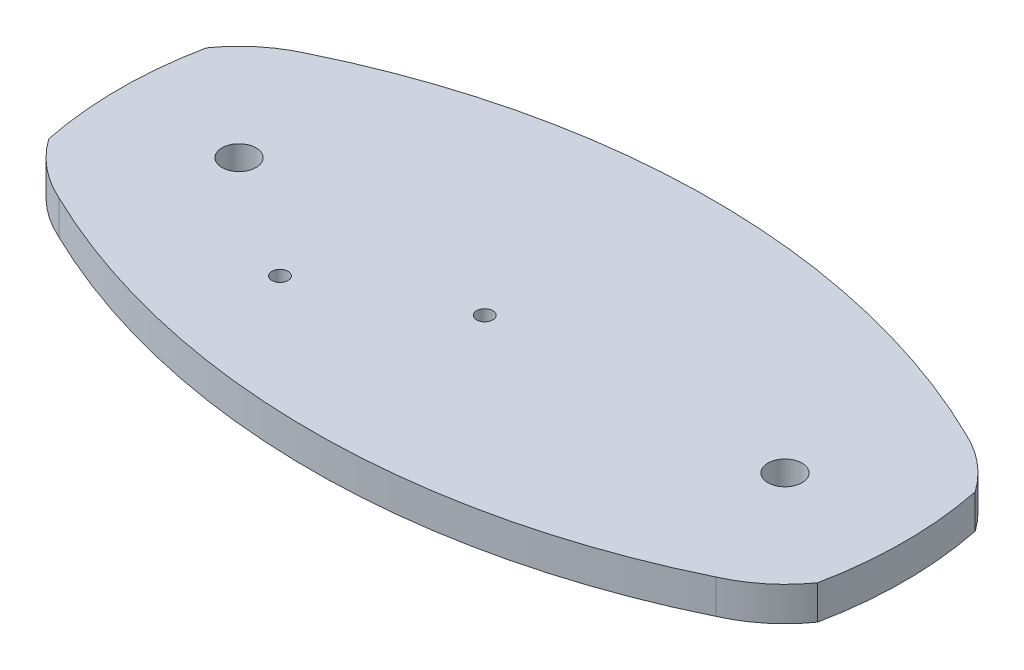
ISO-10303-21;
HEADER;
FILE_DESCRIPTION(('STEP AP214'),'2;1');
FILE_NAME('part.step','',(''),(''),'','','');
FILE_SCHEMA(('AUTOMOTIVE_DESIGN { 1 0 10303 214 1 1 1 1 }'));
ENDSEC;
DATA;
#1=APPLICATION_CONTEXT('core data for automotive mechanical design processes');
#2=APPLICATION_PROTOCOL_DEFINITION('international standard','automotive_design',2000,#1);
#3=PRODUCT_CONTEXT('',#1,'mechanical');
#4=PRODUCT('Part','Part','',(#3));
#5=PRODUCT_RELATED_PRODUCT_CATEGORY('part','',(#4));
#6=PRODUCT_DEFINITION_FORMATION('','',#4);
#7=PRODUCT_DEFINITION_CONTEXT('part definition',#1,'design');
#8=PRODUCT_DEFINITION('design','',#6,#7);
#9=PRODUCT_DEFINITION_SHAPE('','',#8);
#10=(LENGTH_UNIT() NAMED_UNIT(*) SI_UNIT(.MILLI.,.METRE.));
#11=(NAMED_UNIT(*) PLANE_ANGLE_UNIT() SI_UNIT($,.RADIAN.));
#12=(NAMED_UNIT(*) SI_UNIT($,.STERADIAN.) SOLID_ANGLE_UNIT());
#13=UNCERTAINTY_MEASURE_WITH_UNIT(LENGTH_MEASURE(1.E-05),#10,'distance_accuracy_value','');
#14=(GEOMETRIC_REPRESENTATION_CONTEXT(3) GLOBAL_UNCERTAINTY_ASSIGNED_CONTEXT((#13)) GLOBAL_UNIT_ASSIGNED_CONTEXT((#10,
#11,#12)) REPRESENTATION_CONTEXT('',''));
#15=CARTESIAN_POINT('',(0.,0.,0.));
#16=DIRECTION('',(0.,0.,1.));
#17=DIRECTION('',(1.,0.,0.));
#18=AXIS2_PLACEMENT_3D('',#15,#16,#17);
#19=CARTESIAN_POINT('',(0.,6.35,0.));
#20=DIRECTION('',(0.,-1.,0.));
#21=DIRECTION('',(0.,0.,-1.));
#22=AXIS2_PLACEMENT_3D('',#19,#20,#21);
#23=CYLINDRICAL_SURFACE('',#22,73.025);
#24=DIRECTION('',(0.,1.,0.));
#25=VECTOR('',#24,1.);
#26=CARTESIAN_POINT('',(-71.53671875,0.,-14.6679410785359));
#27=LINE('',#26,#25);
#28=CARTESIAN_POINT('',(-71.53671875,0.,-14.6679410785359));
#29=VERTEX_POINT('',#28);
#30=CARTESIAN_POINT('',(-71.53671875,6.35,-14.6679410785359));
#31=VERTEX_POINT('',#30);
#32=EDGE_CURVE('E146',#29,#31,#27,.T.);
#33=ORIENTED_EDGE('',*,*,#32,.F.);
#34=CARTESIAN_POINT('',(0.,0.,0.));
#35=DIRECTION('',(0.,1.,0.));
#36=DIRECTION('',(0.,0.,1.));
#37=AXIS2_PLACEMENT_3D('',#34,#35,#36);
#38=CIRCLE('',#37,73.025);
#39=CARTESIAN_POINT('',(-71.53671875,0.,14.6679410785359));
#40=VERTEX_POINT('',#39);
#41=EDGE_CURVE('E127',#29,#40,#38,.T.);
#42=ORIENTED_EDGE('',*,*,#41,.T.);
#43=DIRECTION('',(0.,1.,0.));
#44=VECTOR('',#43,1.);
#45=CARTESIAN_POINT('',(-71.53671875,0.,14.6679410785359));
#46=LINE('',#45,#44);
#47=CARTESIAN_POINT('',(-71.53671875,6.35,14.6679410785359));
#48=VERTEX_POINT('',#47);
#49=EDGE_CURVE('E64',#40,#48,#46,.T.);
#50=ORIENTED_EDGE('',*,*,#49,.T.);
#51=CARTESIAN_POINT('',(0.,6.35,0.));
#52=DIRECTION('',(0.,1.,0.));
#53=DIRECTION('',(0.,0.,1.));
#54=AXIS2_PLACEMENT_3D('',#51,#52,#53);
#55=CIRCLE('',#54,73.025);
#56=EDGE_CURVE('E49',#31,#48,#55,.T.);
#57=ORIENTED_EDGE('',*,*,#56,.F.);
#58=EDGE_LOOP('',(#33,#42,#50,#57));
#59=FACE_BOUND('',#58,.T.);
#60=ADVANCED_FACE('F40',(#59),#23,.T.);
#61=DIRECTION('',(0.,1.,0.));
#62=VECTOR('',#61,1.);
#63=CARTESIAN_POINT('',(71.53671875,0.,-14.6679410785359));
#64=LINE('',#63,#62);
#65=CARTESIAN_POINT('',(71.53671875,0.,-14.6679410785359));
#66=VERTEX_POINT('',#65);
#67=CARTESIAN_POINT('',(71.53671875,6.35,-14.6679410785359));
#68=VERTEX_POINT('',#67);
#69=EDGE_CURVE('E149',#66,#68,#64,.T.);
#70=ORIENTED_EDGE('',*,*,#69,.T.);
#71=CARTESIAN_POINT('',(71.53671875,6.35,14.6679410785359));
#72=VERTEX_POINT('',#71);
#73=EDGE_CURVE('E11',#72,#68,#55,.T.);
#74=ORIENTED_EDGE('',*,*,#73,.F.);
#75=DIRECTION('',(0.,1.,0.));
#76=VECTOR('',#75,1.);
#77=CARTESIAN_POINT('',(71.53671875,0.,14.6679410785359));
#78=LINE('',#77,#76);
#79=CARTESIAN_POINT('',(71.53671875,0.,14.6679410785359));
#80=VERTEX_POINT('',#79);
#81=EDGE_CURVE('E190',#80,#72,#78,.T.);
#82=ORIENTED_EDGE('',*,*,#81,.F.);
#83=EDGE_CURVE('E43',#80,#66,#38,.T.);
#84=ORIENTED_EDGE('',*,*,#83,.T.);
#85=EDGE_LOOP('',(#70,#74,#82,#84));
#86=FACE_BOUND('',#85,.T.);
#87=ADVANCED_FACE('F209',(#86),#23,.T.);
#88=CARTESIAN_POINT('',(0.,6.35,0.));
#89=DIRECTION('',(0.,1.,0.));
#90=DIRECTION('',(0.,0.,1.));
#91=AXIS2_PLACEMENT_3D('',#88,#89,#90);
#92=PLANE('',#91);
#93=CARTESIAN_POINT('',(-27.94,6.35,15.24));
#94=DIRECTION('',(0.,1.,0.));
#95=DIRECTION('',(0.,0.,1.));
#96=AXIS2_PLACEMENT_3D('',#93,#94,#95);
#97=CIRCLE('',#96,1.49999999999999);
#98=CARTESIAN_POINT('',(-27.94,6.35,16.74));
#99=VERTEX_POINT('',#98);
#100=EDGE_CURVE('E353',#99,#99,#97,.T.);
#101=ORIENTED_EDGE('',*,*,#100,.F.);
#102=EDGE_LOOP('',(#101));
#103=FACE_BOUND('',#102,.T.);
#104=CARTESIAN_POINT('',(-2.54,6.35,2.54));
#105=DIRECTION('',(0.,1.,0.));
#106=DIRECTION('',(0.,0.,1.));
#107=AXIS2_PLACEMENT_3D('',#104,#105,#106);
#108=CIRCLE('',#107,1.49999999999999);
#109=CARTESIAN_POINT('',(-2.54,6.35,4.03999999999999));
#110=VERTEX_POINT('',#109);
#111=EDGE_CURVE('E357',#110,#110,#108,.T.);
#112=ORIENTED_EDGE('',*,*,#111,.F.);
#113=EDGE_LOOP('',(#112));
#114=FACE_BOUND('',#113,.T.);
#115=CARTESIAN_POINT('',(-50.8,6.35,0.));
#116=DIRECTION('',(0.,1.,0.));
#117=DIRECTION('',(0.,0.,1.));
#118=AXIS2_PLACEMENT_3D('',#115,#116,#117);
#119=CIRCLE('',#118,3.175);
#120=CARTESIAN_POINT('',(-50.8,6.35,3.175));
#121=VERTEX_POINT('',#120);
#122=EDGE_CURVE('E159',#121,#121,#119,.T.);
#123=ORIENTED_EDGE('',*,*,#122,.F.);
#124=EDGE_LOOP('',(#123));
#125=FACE_BOUND('',#124,.T.);
#126=CARTESIAN_POINT('',(50.8,6.35,0.));
#127=DIRECTION('',(0.,1.,0.));
#128=DIRECTION('',(0.,0.,1.));
#129=AXIS2_PLACEMENT_3D('',#126,#127,#128);
#130=CIRCLE('',#129,3.175);
#131=CARTESIAN_POINT('',(50.8,6.35,3.175));
#132=VERTEX_POINT('',#131);
#133=EDGE_CURVE('E160',#132,#132,#130,.F.);
#134=ORIENTED_EDGE('',*,*,#133,.T.);
#135=EDGE_LOOP('',(#134));
#136=FACE_BOUND('',#135,.T.);
#137=CARTESIAN_POINT('',(0.,6.35,102.409936312052));
#138=DIRECTION('',(0.,1.,0.));
#139=DIRECTION('',(0.,0.,1.));
#140=AXIS2_PLACEMENT_3D('',#137,#138,#139);
#141=CIRCLE('',#140,139.7);
#142=CARTESIAN_POINT('',(-61.1507706135103,6.35,-23.1952914986316));
#143=VERTEX_POINT('',#142);
#144=CARTESIAN_POINT('',(61.1507706135103,6.35,-23.1952914986316));
#145=VERTEX_POINT('',#144);
#146=EDGE_CURVE('E133',#143,#145,#141,.F.);
#147=ORIENTED_EDGE('',*,*,#146,.F.);
#148=CARTESIAN_POINT('',(-50.8,6.35,0.));
#149=DIRECTION('',(0.,1.,0.));
#150=DIRECTION('',(0.,0.,1.));
#151=AXIS2_PLACEMENT_3D('',#148,#149,#150);
#152=CIRCLE('',#151,25.4);
#153=EDGE_CURVE('E112',#143,#31,#152,.T.);
#154=ORIENTED_EDGE('',*,*,#153,.T.);
#155=ORIENTED_EDGE('',*,*,#56,.T.);
#156=CARTESIAN_POINT('',(-50.8,6.35,0.));
#157=DIRECTION('',(0.,1.,0.));
#158=DIRECTION('',(0.,0.,1.));
#159=AXIS2_PLACEMENT_3D('',#156,#157,#158);
#160=CIRCLE('',#159,25.4);
#161=CARTESIAN_POINT('',(-61.1507706135107,6.35,23.1952914986314));
#162=VERTEX_POINT('',#161);
#163=EDGE_CURVE('E179',#48,#162,#160,.T.);
#164=ORIENTED_EDGE('',*,*,#163,.T.);
#165=CARTESIAN_POINT('',(0.,6.35,-102.409936312052));
#166=DIRECTION('',(0.,1.,0.));
#167=DIRECTION('',(0.,0.,1.));
#168=AXIS2_PLACEMENT_3D('',#165,#166,#167);
#169=CIRCLE('',#168,139.7);
#170=CARTESIAN_POINT('',(61.1507706135112,6.35,23.1952914986312));
#171=VERTEX_POINT('',#170);
#172=EDGE_CURVE('E175',#162,#171,#169,.T.);
#173=ORIENTED_EDGE('',*,*,#172,.T.);
#174=CARTESIAN_POINT('',(50.8,6.35,0.));
#175=DIRECTION('',(0.,1.,0.));
#176=DIRECTION('',(0.,0.,1.));
#177=AXIS2_PLACEMENT_3D('',#174,#175,#176);
#178=CIRCLE('',#177,25.4);
#179=EDGE_CURVE('E168',#171,#72,#178,.T.);
#180=ORIENTED_EDGE('',*,*,#179,.T.);
#181=ORIENTED_EDGE('',*,*,#73,.T.);
#182=CARTESIAN_POINT('',(50.8,6.35,0.));
#183=DIRECTION('',(0.,1.,0.));
#184=DIRECTION('',(0.,0.,1.));
#185=AXIS2_PLACEMENT_3D('',#182,#183,#184);
#186=CIRCLE('',#185,25.4);
#187=EDGE_CURVE('E129',#68,#145,#186,.T.);
#188=ORIENTED_EDGE('',*,*,#187,.T.);
#189=EDGE_LOOP('',(#147,#154,#155,#164,#173,#180,#181,#188));
#190=FACE_BOUND('',#189,.T.);
#191=ADVANCED_FACE('F206',(#103,#114,#125,#136,#190),#92,.T.);
#192=CARTESIAN_POINT('',(0.,0.,0.));
#193=DIRECTION('',(0.,1.,0.));
#194=DIRECTION('',(0.,0.,1.));
#195=AXIS2_PLACEMENT_3D('',#192,#193,#194);
#196=PLANE('',#195);
#197=CARTESIAN_POINT('',(-27.94,0.,15.24));
#198=DIRECTION('',(0.,1.,0.));
#199=DIRECTION('',(0.,0.,1.));
#200=AXIS2_PLACEMENT_3D('',#197,#198,#199);
#201=CIRCLE('',#200,1.5);
#202=CARTESIAN_POINT('',(-27.94,0.,16.74));
#203=VERTEX_POINT('',#202);
#204=EDGE_CURVE('E350',#203,#203,#201,.T.);
#205=ORIENTED_EDGE('',*,*,#204,.T.);
#206=EDGE_LOOP('',(#205));
#207=FACE_BOUND('',#206,.T.);
#208=CARTESIAN_POINT('',(-2.54,0.,2.54));
#209=DIRECTION('',(0.,1.,0.));
#210=DIRECTION('',(0.,0.,1.));
#211=AXIS2_PLACEMENT_3D('',#208,#209,#210);
#212=CIRCLE('',#211,1.5);
#213=CARTESIAN_POINT('',(-2.54,0.,4.04));
#214=VERTEX_POINT('',#213);
#215=EDGE_CURVE('E136',#214,#214,#212,.T.);
#216=ORIENTED_EDGE('',*,*,#215,.T.);
#217=EDGE_LOOP('',(#216));
#218=FACE_BOUND('',#217,.T.);
#219=CARTESIAN_POINT('',(50.8,0.,0.));
#220=DIRECTION('',(0.,1.,0.));
#221=DIRECTION('',(0.,0.,1.));
#222=AXIS2_PLACEMENT_3D('',#219,#220,#221);
#223=CIRCLE('',#222,3.175);
#224=CARTESIAN_POINT('',(50.8,0.,3.175));
#225=VERTEX_POINT('',#224);
#226=EDGE_CURVE('E155',#225,#225,#223,.F.);
#227=ORIENTED_EDGE('',*,*,#226,.F.);
#228=EDGE_LOOP('',(#227));
#229=FACE_BOUND('',#228,.T.);
#230=CARTESIAN_POINT('',(-50.8,0.,0.));
#231=DIRECTION('',(0.,1.,0.));
#232=DIRECTION('',(0.,0.,1.));
#233=AXIS2_PLACEMENT_3D('',#230,#231,#232);
#234=CIRCLE('',#233,3.175);
#235=CARTESIAN_POINT('',(-50.8,0.,3.175));
#236=VERTEX_POINT('',#235);
#237=EDGE_CURVE('E180',#236,#236,#234,.T.);
#238=ORIENTED_EDGE('',*,*,#237,.T.);
#239=EDGE_LOOP('',(#238));
#240=FACE_BOUND('',#239,.T.);
#241=CARTESIAN_POINT('',(-50.8,0.,0.));
#242=DIRECTION('',(0.,1.,0.));
#243=DIRECTION('',(0.,0.,1.));
#244=AXIS2_PLACEMENT_3D('',#241,#242,#243);
#245=CIRCLE('',#244,25.4);
#246=CARTESIAN_POINT('',(-61.1507706135103,0.,-23.1952914986316));
#247=VERTEX_POINT('',#246);
#248=EDGE_CURVE('E109',#247,#29,#245,.T.);
#249=ORIENTED_EDGE('',*,*,#248,.F.);
#250=CARTESIAN_POINT('',(0.,0.,102.409936312052));
#251=DIRECTION('',(0.,1.,0.));
#252=DIRECTION('',(0.,0.,1.));
#253=AXIS2_PLACEMENT_3D('',#250,#251,#252);
#254=CIRCLE('',#253,139.7);
#255=CARTESIAN_POINT('',(61.1507706135103,0.,-23.1952914986316));
#256=VERTEX_POINT('',#255);
#257=EDGE_CURVE('E118',#247,#256,#254,.F.);
#258=ORIENTED_EDGE('',*,*,#257,.T.);
#259=CARTESIAN_POINT('',(50.8,0.,0.));
#260=DIRECTION('',(0.,1.,0.));
#261=DIRECTION('',(0.,0.,1.));
#262=AXIS2_PLACEMENT_3D('',#259,#260,#261);
#263=CIRCLE('',#262,25.4);
#264=EDGE_CURVE('E115',#66,#256,#263,.T.);
#265=ORIENTED_EDGE('',*,*,#264,.F.);
#266=ORIENTED_EDGE('',*,*,#83,.F.);
#267=CARTESIAN_POINT('',(50.8,0.,0.));
#268=DIRECTION('',(0.,1.,0.));
#269=DIRECTION('',(0.,0.,1.));
#270=AXIS2_PLACEMENT_3D('',#267,#268,#269);
#271=CIRCLE('',#270,25.4);
#272=CARTESIAN_POINT('',(61.1507706135112,0.,23.1952914986312));
#273=VERTEX_POINT('',#272);
#274=EDGE_CURVE('E171',#273,#80,#271,.T.);
#275=ORIENTED_EDGE('',*,*,#274,.F.);
#276=CARTESIAN_POINT('',(0.,0.,-102.409936312052));
#277=DIRECTION('',(0.,1.,0.));
#278=DIRECTION('',(0.,0.,1.));
#279=AXIS2_PLACEMENT_3D('',#276,#277,#278);
#280=CIRCLE('',#279,139.7);
#281=CARTESIAN_POINT('',(-61.1507706135107,0.,23.1952914986314));
#282=VERTEX_POINT('',#281);
#283=EDGE_CURVE('E164',#282,#273,#280,.T.);
#284=ORIENTED_EDGE('',*,*,#283,.F.);
#285=CARTESIAN_POINT('',(-50.8,0.,0.));
#286=DIRECTION('',(0.,1.,0.));
#287=DIRECTION('',(0.,0.,1.));
#288=AXIS2_PLACEMENT_3D('',#285,#286,#287);
#289=CIRCLE('',#288,25.4);
#290=EDGE_CURVE('E167',#40,#282,#289,.T.);
#291=ORIENTED_EDGE('',*,*,#290,.F.);
#292=ORIENTED_EDGE('',*,*,#41,.F.);
#293=EDGE_LOOP('',(#249,#258,#265,#266,#275,#284,#291,#292));
#294=FACE_BOUND('',#293,.T.);
#295=ADVANCED_FACE('F125',(#207,#218,#229,#240,#294),#196,.F.);
#296=CARTESIAN_POINT('',(0.,0.,-102.409936312052));
#297=DIRECTION('',(0.,1.,0.));
#298=DIRECTION('',(0.,0.,1.));
#299=AXIS2_PLACEMENT_3D('',#296,#297,#298);
#300=CYLINDRICAL_SURFACE('',#299,139.7);
#301=ORIENTED_EDGE('',*,*,#172,.F.);
#302=DIRECTION('',(0.,1.,0.));
#303=VECTOR('',#302,1.);
#304=CARTESIAN_POINT('',(-61.1507706135107,0.,23.1952914986314));
#305=LINE('',#304,#303);
#306=EDGE_CURVE('E174',#282,#162,#305,.T.);
#307=ORIENTED_EDGE('',*,*,#306,.F.);
#308=ORIENTED_EDGE('',*,*,#283,.T.);
#309=DIRECTION('',(0.,1.,0.));
#310=VECTOR('',#309,1.);
#311=CARTESIAN_POINT('',(61.1507706135112,0.,23.1952914986312));
#312=LINE('',#311,#310);
#313=EDGE_CURVE('E143',#273,#171,#312,.T.);
#314=ORIENTED_EDGE('',*,*,#313,.T.);
#315=EDGE_LOOP('',(#301,#307,#308,#314));
#316=FACE_BOUND('',#315,.T.);
#317=ADVANCED_FACE('F233',(#316),#300,.T.);
#318=CARTESIAN_POINT('',(50.8,0.,0.));
#319=DIRECTION('',(0.,1.,0.));
#320=DIRECTION('',(0.,0.,1.));
#321=AXIS2_PLACEMENT_3D('',#318,#319,#320);
#322=CYLINDRICAL_SURFACE('',#321,25.4);
#323=ORIENTED_EDGE('',*,*,#179,.F.);
#324=ORIENTED_EDGE('',*,*,#313,.F.);
#325=ORIENTED_EDGE('',*,*,#274,.T.);
#326=ORIENTED_EDGE('',*,*,#81,.T.);
#327=EDGE_LOOP('',(#323,#324,#325,#326));
#328=FACE_BOUND('',#327,.T.);
#329=ADVANCED_FACE('F236',(#328),#322,.T.);
#330=CARTESIAN_POINT('',(-50.8,0.,0.));
#331=DIRECTION('',(0.,1.,0.));
#332=DIRECTION('',(0.,0.,1.));
#333=AXIS2_PLACEMENT_3D('',#330,#331,#332);
#334=CYLINDRICAL_SURFACE('',#333,25.4);
#335=ORIENTED_EDGE('',*,*,#163,.F.);
#336=ORIENTED_EDGE('',*,*,#49,.F.);
#337=ORIENTED_EDGE('',*,*,#290,.T.);
#338=ORIENTED_EDGE('',*,*,#306,.T.);
#339=EDGE_LOOP('',(#335,#336,#337,#338));
#340=FACE_BOUND('',#339,.T.);
#341=ADVANCED_FACE('F229',(#340),#334,.T.);
#342=CARTESIAN_POINT('',(-50.8,0.,0.));
#343=DIRECTION('',(0.,1.,0.));
#344=DIRECTION('',(0.,0.,1.));
#345=AXIS2_PLACEMENT_3D('',#342,#343,#344);
#346=CYLINDRICAL_SURFACE('',#345,3.175);
#347=ORIENTED_EDGE('',*,*,#237,.F.);
#348=EDGE_LOOP('',(#347));
#349=FACE_BOUND('',#348,.T.);
#350=ORIENTED_EDGE('',*,*,#122,.T.);
#351=EDGE_LOOP('',(#350));
#352=FACE_BOUND('',#351,.T.);
#353=ADVANCED_FACE('F204',(#349,#352),#346,.F.);
#354=CARTESIAN_POINT('',(50.8,0.,0.));
#355=DIRECTION('',(0.,1.,0.));
#356=DIRECTION('',(0.,0.,1.));
#357=AXIS2_PLACEMENT_3D('',#354,#355,#356);
#358=CYLINDRICAL_SURFACE('',#357,3.175);
#359=ORIENTED_EDGE('',*,*,#226,.T.);
#360=EDGE_LOOP('',(#359));
#361=FACE_BOUND('',#360,.T.);
#362=ORIENTED_EDGE('',*,*,#133,.F.);
#363=EDGE_LOOP('',(#362));
#364=FACE_BOUND('',#363,.T.);
#365=ADVANCED_FACE('F292',(#361,#364),#358,.F.);
#366=CARTESIAN_POINT('',(-50.8,0.,0.));
#367=DIRECTION('',(0.,1.,0.));
#368=DIRECTION('',(0.,0.,1.));
#369=AXIS2_PLACEMENT_3D('',#366,#367,#368);
#370=CYLINDRICAL_SURFACE('',#369,25.4);
#371=ORIENTED_EDGE('',*,*,#153,.F.);
#372=DIRECTION('',(0.,1.,0.));
#373=VECTOR('',#372,1.);
#374=CARTESIAN_POINT('',(-61.1507706135103,0.,-23.1952914986316));
#375=LINE('',#374,#373);
#376=EDGE_CURVE('E106',#247,#143,#375,.T.);
#377=ORIENTED_EDGE('',*,*,#376,.F.);
#378=ORIENTED_EDGE('',*,*,#248,.T.);
#379=ORIENTED_EDGE('',*,*,#32,.T.);
#380=EDGE_LOOP('',(#371,#377,#378,#379));
#381=FACE_BOUND('',#380,.T.);
#382=ADVANCED_FACE('F107',(#381),#370,.T.);
#383=CARTESIAN_POINT('',(50.8,0.,0.));
#384=DIRECTION('',(0.,1.,0.));
#385=DIRECTION('',(0.,0.,1.));
#386=AXIS2_PLACEMENT_3D('',#383,#384,#385);
#387=CYLINDRICAL_SURFACE('',#386,25.4);
#388=ORIENTED_EDGE('',*,*,#187,.F.);
#389=ORIENTED_EDGE('',*,*,#69,.F.);
#390=ORIENTED_EDGE('',*,*,#264,.T.);
#391=DIRECTION('',(0.,1.,0.));
#392=VECTOR('',#391,1.);
#393=CARTESIAN_POINT('',(61.1507706135103,0.,-23.1952914986316));
#394=LINE('',#393,#392);
#395=EDGE_CURVE('E56',#256,#145,#394,.T.);
#396=ORIENTED_EDGE('',*,*,#395,.T.);
#397=EDGE_LOOP('',(#388,#389,#390,#396));
#398=FACE_BOUND('',#397,.T.);
#399=ADVANCED_FACE('F218',(#398),#387,.T.);
#400=CARTESIAN_POINT('',(0.,0.,102.409936312052));
#401=DIRECTION('',(0.,1.,0.));
#402=DIRECTION('',(0.,0.,1.));
#403=AXIS2_PLACEMENT_3D('',#400,#401,#402);
#404=CYLINDRICAL_SURFACE('',#403,139.7);
#405=ORIENTED_EDGE('',*,*,#146,.T.);
#406=ORIENTED_EDGE('',*,*,#395,.F.);
#407=ORIENTED_EDGE('',*,*,#257,.F.);
#408=ORIENTED_EDGE('',*,*,#376,.T.);
#409=EDGE_LOOP('',(#405,#406,#407,#408));
#410=FACE_BOUND('',#409,.T.);
#411=ADVANCED_FACE('F119',(#410),#404,.T.);
#412=CARTESIAN_POINT('',(-2.54,6.35,2.54));
#413=DIRECTION('',(0.,1.,0.));
#414=DIRECTION('',(0.,0.,1.));
#415=AXIS2_PLACEMENT_3D('',#412,#413,#414);
#416=CYLINDRICAL_SURFACE('',#415,1.49999999999999);
#417=ORIENTED_EDGE('',*,*,#215,.F.);
#418=EDGE_LOOP('',(#417));
#419=FACE_BOUND('',#418,.T.);
#420=ORIENTED_EDGE('',*,*,#111,.T.);
#421=EDGE_LOOP('',(#420));
#422=FACE_BOUND('',#421,.T.);
#423=ADVANCED_FACE('F324',(#419,#422),#416,.F.);
#424=CARTESIAN_POINT('',(-27.94,6.35,15.24));
#425=DIRECTION('',(0.,1.,0.));
#426=DIRECTION('',(0.,0.,1.));
#427=AXIS2_PLACEMENT_3D('',#424,#425,#426);
#428=CYLINDRICAL_SURFACE('',#427,1.49999999999999);
#429=ORIENTED_EDGE('',*,*,#204,.F.);
#430=EDGE_LOOP('',(#429));
#431=FACE_BOUND('',#430,.T.);
#432=ORIENTED_EDGE('',*,*,#100,.T.);
#433=EDGE_LOOP('',(#432));
#434=FACE_BOUND('',#433,.T.);
#435=ADVANCED_FACE('F333',(#431,#434),#428,.F.);
#436=CLOSED_SHELL('',(#60,#87,#191,#295,#317,#329,#341,#353,#365,#382,#399,#411,#423,#435));
#437=MANIFOLD_SOLID_BREP('B2',#436);
#438=ADVANCED_BREP_SHAPE_REPRESENTATION('',(#18,#437),#14);
#439=SHAPE_DEFINITION_REPRESENTATION(#9,#438);
ENDSEC;
END-ISO-10303-21;
